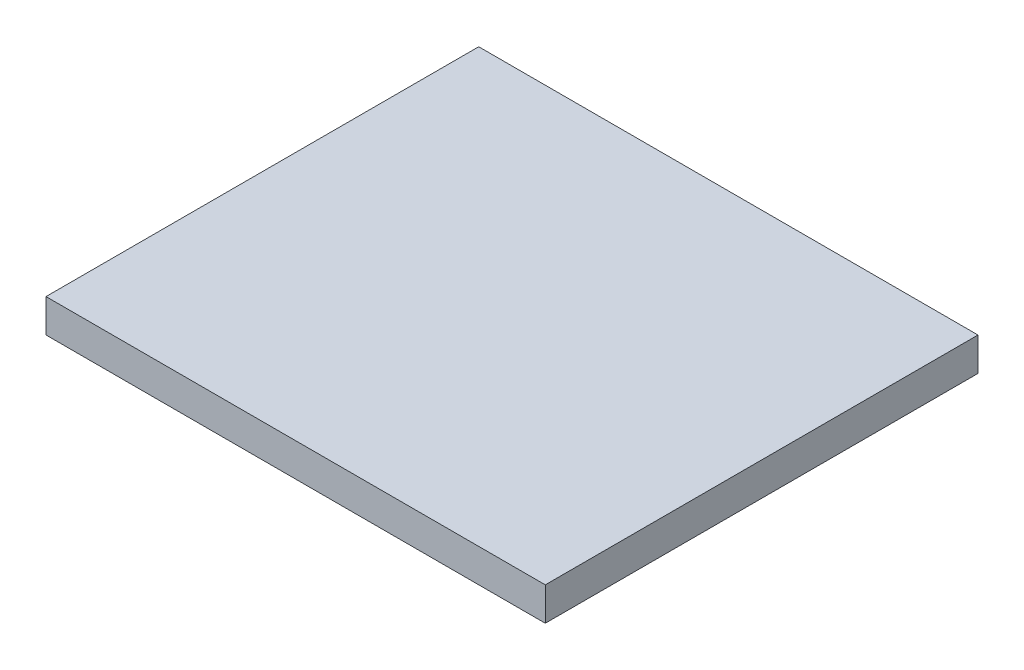
ISO-10303-21;
HEADER;
FILE_DESCRIPTION(('STEP AP214'),'2;1');
FILE_NAME('part.step','',(''),(''),'','','');
FILE_SCHEMA(('AUTOMOTIVE_DESIGN { 1 0 10303 214 1 1 1 1 }'));
ENDSEC;
DATA;
#1=APPLICATION_CONTEXT('core data for automotive mechanical design processes');
#2=APPLICATION_PROTOCOL_DEFINITION('international standard','automotive_design',2000,#1);
#3=PRODUCT_CONTEXT('',#1,'mechanical');
#4=PRODUCT('Part','Part','',(#3));
#5=PRODUCT_RELATED_PRODUCT_CATEGORY('part','',(#4));
#6=PRODUCT_DEFINITION_FORMATION('','',#4);
#7=PRODUCT_DEFINITION_CONTEXT('part definition',#1,'design');
#8=PRODUCT_DEFINITION('design','',#6,#7);
#9=PRODUCT_DEFINITION_SHAPE('','',#8);
#10=(LENGTH_UNIT() NAMED_UNIT(*) SI_UNIT(.MILLI.,.METRE.));
#11=(NAMED_UNIT(*) PLANE_ANGLE_UNIT() SI_UNIT($,.RADIAN.));
#12=(NAMED_UNIT(*) SI_UNIT($,.STERADIAN.) SOLID_ANGLE_UNIT());
#13=UNCERTAINTY_MEASURE_WITH_UNIT(LENGTH_MEASURE(1.E-05),#10,'distance_accuracy_value','');
#14=(GEOMETRIC_REPRESENTATION_CONTEXT(3) GLOBAL_UNCERTAINTY_ASSIGNED_CONTEXT((#13)) GLOBAL_UNIT_ASSIGNED_CONTEXT((#10,
#11,#12)) REPRESENTATION_CONTEXT('',''));
#15=CARTESIAN_POINT('',(0.,0.,0.));
#16=DIRECTION('',(0.,0.,1.));
#17=DIRECTION('',(1.,0.,0.));
#18=AXIS2_PLACEMENT_3D('',#15,#16,#17);
#19=CARTESIAN_POINT('',(0.,1000.,-13000.));
#20=DIRECTION('',(0.,0.,-1.));
#21=DIRECTION('',(-1.,0.,0.));
#22=AXIS2_PLACEMENT_3D('',#19,#20,#21);
#23=PLANE('',#22);
#24=DIRECTION('',(1.,0.,0.));
#25=VECTOR('',#24,1.);
#26=CARTESIAN_POINT('',(0.,0.,-13000.));
#27=LINE('',#26,#25);
#28=CARTESIAN_POINT('',(0.,0.,-13000.));
#29=VERTEX_POINT('',#28);
#30=CARTESIAN_POINT('',(15000.,0.,-13000.));
#31=VERTEX_POINT('',#30);
#32=EDGE_CURVE('E99',#29,#31,#27,.T.);
#33=ORIENTED_EDGE('',*,*,#32,.F.);
#34=DIRECTION('',(0.,-1.,0.));
#35=VECTOR('',#34,1.);
#36=CARTESIAN_POINT('',(0.,1000.,-13000.));
#37=LINE('',#36,#35);
#38=CARTESIAN_POINT('',(0.,1000.,-13000.));
#39=VERTEX_POINT('',#38);
#40=EDGE_CURVE('E11',#39,#29,#37,.T.);
#41=ORIENTED_EDGE('',*,*,#40,.F.);
#42=DIRECTION('',(1.,0.,0.));
#43=VECTOR('',#42,1.);
#44=CARTESIAN_POINT('',(0.,1000.,-13000.));
#45=LINE('',#44,#43);
#46=CARTESIAN_POINT('',(15000.,1000.,-13000.));
#47=VERTEX_POINT('',#46);
#48=EDGE_CURVE('E93',#39,#47,#45,.T.);
#49=ORIENTED_EDGE('',*,*,#48,.T.);
#50=DIRECTION('',(0.,-1.,0.));
#51=VECTOR('',#50,1.);
#52=CARTESIAN_POINT('',(15000.,1000.,-13000.));
#53=LINE('',#52,#51);
#54=EDGE_CURVE('E38',#47,#31,#53,.T.);
#55=ORIENTED_EDGE('',*,*,#54,.T.);
#56=EDGE_LOOP('',(#33,#41,#49,#55));
#57=FACE_BOUND('',#56,.T.);
#58=ADVANCED_FACE('F35',(#57),#23,.T.);
#59=CARTESIAN_POINT('',(0.,1000.,0.));
#60=DIRECTION('',(-1.,0.,0.));
#61=DIRECTION('',(0.,0.,1.));
#62=AXIS2_PLACEMENT_3D('',#59,#60,#61);
#63=PLANE('',#62);
#64=DIRECTION('',(0.,0.,-1.));
#65=VECTOR('',#64,1.);
#66=CARTESIAN_POINT('',(0.,0.,0.));
#67=LINE('',#66,#65);
#68=CARTESIAN_POINT('',(0.,0.,0.));
#69=VERTEX_POINT('',#68);
#70=EDGE_CURVE('E95',#69,#29,#67,.T.);
#71=ORIENTED_EDGE('',*,*,#70,.F.);
#72=DIRECTION('',(0.,-1.,0.));
#73=VECTOR('',#72,1.);
#74=CARTESIAN_POINT('',(0.,1000.,0.));
#75=LINE('',#74,#73);
#76=CARTESIAN_POINT('',(0.,1000.,0.));
#77=VERTEX_POINT('',#76);
#78=EDGE_CURVE('E44',#77,#69,#75,.T.);
#79=ORIENTED_EDGE('',*,*,#78,.F.);
#80=DIRECTION('',(0.,0.,-1.));
#81=VECTOR('',#80,1.);
#82=CARTESIAN_POINT('',(0.,1000.,0.));
#83=LINE('',#82,#81);
#84=EDGE_CURVE('E83',#77,#39,#83,.T.);
#85=ORIENTED_EDGE('',*,*,#84,.T.);
#86=ORIENTED_EDGE('',*,*,#40,.T.);
#87=EDGE_LOOP('',(#71,#79,#85,#86));
#88=FACE_BOUND('',#87,.T.);
#89=ADVANCED_FACE('F109',(#88),#63,.T.);
#90=CARTESIAN_POINT('',(0.,1000.,0.));
#91=DIRECTION('',(0.,0.,-1.));
#92=DIRECTION('',(-1.,0.,0.));
#93=AXIS2_PLACEMENT_3D('',#90,#91,#92);
#94=PLANE('',#93);
#95=DIRECTION('',(1.,0.,0.));
#96=VECTOR('',#95,1.);
#97=CARTESIAN_POINT('',(0.,0.,0.));
#98=LINE('',#97,#96);
#99=CARTESIAN_POINT('',(15000.,0.,0.));
#100=VERTEX_POINT('',#99);
#101=EDGE_CURVE('E88',#69,#100,#98,.T.);
#102=ORIENTED_EDGE('',*,*,#101,.T.);
#103=DIRECTION('',(0.,-1.,0.));
#104=VECTOR('',#103,1.);
#105=CARTESIAN_POINT('',(15000.,1000.,0.));
#106=LINE('',#105,#104);
#107=CARTESIAN_POINT('',(15000.,1000.,0.));
#108=VERTEX_POINT('',#107);
#109=EDGE_CURVE('E86',#108,#100,#106,.T.);
#110=ORIENTED_EDGE('',*,*,#109,.F.);
#111=DIRECTION('',(1.,0.,0.));
#112=VECTOR('',#111,1.);
#113=CARTESIAN_POINT('',(0.,1000.,0.));
#114=LINE('',#113,#112);
#115=EDGE_CURVE('E80',#77,#108,#114,.T.);
#116=ORIENTED_EDGE('',*,*,#115,.F.);
#117=ORIENTED_EDGE('',*,*,#78,.T.);
#118=EDGE_LOOP('',(#102,#110,#116,#117));
#119=FACE_BOUND('',#118,.T.);
#120=ADVANCED_FACE('F87',(#119),#94,.F.);
#121=CARTESIAN_POINT('',(15000.,1000.,0.));
#122=DIRECTION('',(-1.,0.,0.));
#123=DIRECTION('',(0.,0.,1.));
#124=AXIS2_PLACEMENT_3D('',#121,#122,#123);
#125=PLANE('',#124);
#126=DIRECTION('',(0.,0.,-1.));
#127=VECTOR('',#126,1.);
#128=CARTESIAN_POINT('',(15000.,0.,0.));
#129=LINE('',#128,#127);
#130=EDGE_CURVE('E102',#100,#31,#129,.T.);
#131=ORIENTED_EDGE('',*,*,#130,.T.);
#132=ORIENTED_EDGE('',*,*,#54,.F.);
#133=DIRECTION('',(0.,0.,-1.));
#134=VECTOR('',#133,1.);
#135=CARTESIAN_POINT('',(15000.,1000.,0.));
#136=LINE('',#135,#134);
#137=EDGE_CURVE('E77',#108,#47,#136,.T.);
#138=ORIENTED_EDGE('',*,*,#137,.F.);
#139=ORIENTED_EDGE('',*,*,#109,.T.);
#140=EDGE_LOOP('',(#131,#132,#138,#139));
#141=FACE_BOUND('',#140,.T.);
#142=ADVANCED_FACE('F92',(#141),#125,.F.);
#143=CARTESIAN_POINT('',(0.,1000.,0.));
#144=DIRECTION('',(0.,1.,0.));
#145=DIRECTION('',(0.,0.,1.));
#146=AXIS2_PLACEMENT_3D('',#143,#144,#145);
#147=PLANE('',#146);
#148=ORIENTED_EDGE('',*,*,#48,.F.);
#149=ORIENTED_EDGE('',*,*,#84,.F.);
#150=ORIENTED_EDGE('',*,*,#115,.T.);
#151=ORIENTED_EDGE('',*,*,#137,.T.);
#152=EDGE_LOOP('',(#148,#149,#150,#151));
#153=FACE_BOUND('',#152,.T.);
#154=ADVANCED_FACE('F82',(#153),#147,.T.);
#155=CARTESIAN_POINT('',(0.,0.,0.));
#156=DIRECTION('',(0.,1.,0.));
#157=DIRECTION('',(0.,0.,1.));
#158=AXIS2_PLACEMENT_3D('',#155,#156,#157);
#159=PLANE('',#158);
#160=ORIENTED_EDGE('',*,*,#32,.T.);
#161=ORIENTED_EDGE('',*,*,#130,.F.);
#162=ORIENTED_EDGE('',*,*,#101,.F.);
#163=ORIENTED_EDGE('',*,*,#70,.T.);
#164=EDGE_LOOP('',(#160,#161,#162,#163));
#165=FACE_BOUND('',#164,.T.);
#166=ADVANCED_FACE('F108',(#165),#159,.F.);
#167=CLOSED_SHELL('',(#58,#89,#120,#142,#154,#166));
#168=MANIFOLD_SOLID_BREP('B2',#167);
#169=ADVANCED_BREP_SHAPE_REPRESENTATION('',(#18,#168),#14);
#170=SHAPE_DEFINITION_REPRESENTATION(#9,#169);
ENDSEC;
END-ISO-10303-21;
